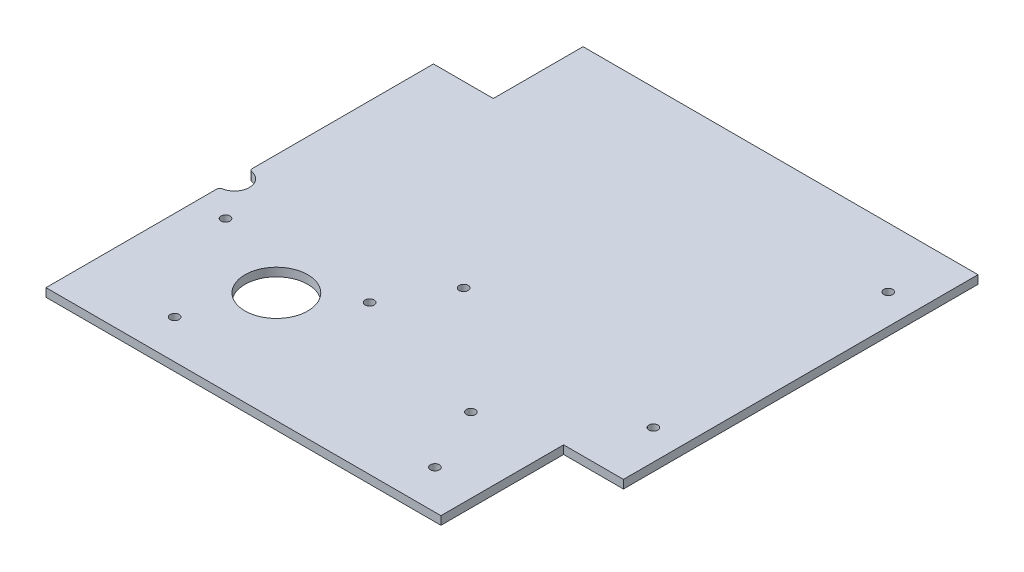
ISO-10303-21;
HEADER;
FILE_DESCRIPTION(('STEP AP214'),'2;1');
FILE_NAME('part.step','',(''),(''),'','','');
FILE_SCHEMA(('AUTOMOTIVE_DESIGN { 1 0 10303 214 1 1 1 1 }'));
ENDSEC;
DATA;
#1=APPLICATION_CONTEXT('core data for automotive mechanical design processes');
#2=APPLICATION_PROTOCOL_DEFINITION('international standard','automotive_design',2000,#1);
#3=PRODUCT_CONTEXT('',#1,'mechanical');
#4=PRODUCT('Part','Part','',(#3));
#5=PRODUCT_RELATED_PRODUCT_CATEGORY('part','',(#4));
#6=PRODUCT_DEFINITION_FORMATION('','',#4);
#7=PRODUCT_DEFINITION_CONTEXT('part definition',#1,'design');
#8=PRODUCT_DEFINITION('design','',#6,#7);
#9=PRODUCT_DEFINITION_SHAPE('','',#8);
#10=(LENGTH_UNIT() NAMED_UNIT(*) SI_UNIT(.MILLI.,.METRE.));
#11=(NAMED_UNIT(*) PLANE_ANGLE_UNIT() SI_UNIT($,.RADIAN.));
#12=(NAMED_UNIT(*) SI_UNIT($,.STERADIAN.) SOLID_ANGLE_UNIT());
#13=UNCERTAINTY_MEASURE_WITH_UNIT(LENGTH_MEASURE(1.E-05),#10,'distance_accuracy_value','');
#14=(GEOMETRIC_REPRESENTATION_CONTEXT(3) GLOBAL_UNCERTAINTY_ASSIGNED_CONTEXT((#13)) GLOBAL_UNIT_ASSIGNED_CONTEXT((#10,
#11,#12)) REPRESENTATION_CONTEXT('',''));
#15=CARTESIAN_POINT('',(0.,0.,0.));
#16=DIRECTION('',(0.,0.,1.));
#17=DIRECTION('',(1.,0.,0.));
#18=AXIS2_PLACEMENT_3D('',#15,#16,#17);
#19=CARTESIAN_POINT('',(-76.,2.8,0.));
#20=DIRECTION('',(-1.,0.,0.));
#21=DIRECTION('',(0.,0.,1.));
#22=AXIS2_PLACEMENT_3D('',#19,#20,#21);
#23=PLANE('',#22);
#24=DIRECTION('',(0.,0.,-1.));
#25=VECTOR('',#24,1.);
#26=CARTESIAN_POINT('',(-76.,2.8,0.));
#27=LINE('',#26,#25);
#28=CARTESIAN_POINT('',(-76.,2.8,79.75));
#29=VERTEX_POINT('',#28);
#30=CARTESIAN_POINT('',(-76.,2.8,22.6660797830996));
#31=VERTEX_POINT('',#30);
#32=EDGE_CURVE('E158',#29,#31,#27,.T.);
#33=ORIENTED_EDGE('',*,*,#32,.T.);
#34=DIRECTION('',(0.,-1.,0.));
#35=VECTOR('',#34,1.);
#36=CARTESIAN_POINT('',(-76.,0.,22.6660797830996));
#37=LINE('',#36,#35);
#38=CARTESIAN_POINT('',(-76.,0.,22.6660797830996));
#39=VERTEX_POINT('',#38);
#40=EDGE_CURVE('E134',#31,#39,#37,.T.);
#41=ORIENTED_EDGE('',*,*,#40,.T.);
#42=DIRECTION('',(0.,0.,-1.));
#43=VECTOR('',#42,1.);
#44=CARTESIAN_POINT('',(-76.,0.,0.));
#45=LINE('',#44,#43);
#46=CARTESIAN_POINT('',(-76.,0.,79.75));
#47=VERTEX_POINT('',#46);
#48=EDGE_CURVE('E194',#47,#39,#45,.T.);
#49=ORIENTED_EDGE('',*,*,#48,.F.);
#50=DIRECTION('',(0.,-1.,0.));
#51=VECTOR('',#50,1.);
#52=CARTESIAN_POINT('',(-76.,2.8,79.75));
#53=LINE('',#52,#51);
#54=EDGE_CURVE('E220',#29,#47,#53,.T.);
#55=ORIENTED_EDGE('',*,*,#54,.F.);
#56=EDGE_LOOP('',(#33,#41,#49,#55));
#57=FACE_BOUND('',#56,.T.);
#58=ADVANCED_FACE('F35',(#57),#23,.T.);
#59=CARTESIAN_POINT('',(0.,2.8,-79.75));
#60=DIRECTION('',(0.,0.,-1.));
#61=DIRECTION('',(-1.,0.,0.));
#62=AXIS2_PLACEMENT_3D('',#59,#60,#61);
#63=PLANE('',#62);
#64=DIRECTION('',(1.,0.,0.));
#65=VECTOR('',#64,1.);
#66=CARTESIAN_POINT('',(0.,0.,-79.75));
#67=LINE('',#66,#65);
#68=CARTESIAN_POINT('',(-56.,0.,-79.75));
#69=VERTEX_POINT('',#68);
#70=CARTESIAN_POINT('',(76.,0.,-79.75));
#71=VERTEX_POINT('',#70);
#72=EDGE_CURVE('E130',#69,#71,#67,.T.);
#73=ORIENTED_EDGE('',*,*,#72,.F.);
#74=DIRECTION('',(0.,-1.,0.));
#75=VECTOR('',#74,1.);
#76=CARTESIAN_POINT('',(-56.,2.8,-79.75));
#77=LINE('',#76,#75);
#78=CARTESIAN_POINT('',(-56.,2.8,-79.75));
#79=VERTEX_POINT('',#78);
#80=EDGE_CURVE('E124',#79,#69,#77,.T.);
#81=ORIENTED_EDGE('',*,*,#80,.F.);
#82=DIRECTION('',(1.,0.,0.));
#83=VECTOR('',#82,1.);
#84=CARTESIAN_POINT('',(0.,2.8,-79.75));
#85=LINE('',#84,#83);
#86=CARTESIAN_POINT('',(76.,2.8,-79.75));
#87=VERTEX_POINT('',#86);
#88=EDGE_CURVE('E128',#79,#87,#85,.T.);
#89=ORIENTED_EDGE('',*,*,#88,.T.);
#90=DIRECTION('',(0.,-1.,0.));
#91=VECTOR('',#90,1.);
#92=CARTESIAN_POINT('',(76.,2.8,-79.75));
#93=LINE('',#92,#91);
#94=EDGE_CURVE('E170',#87,#71,#93,.T.);
#95=ORIENTED_EDGE('',*,*,#94,.T.);
#96=EDGE_LOOP('',(#73,#81,#89,#95));
#97=FACE_BOUND('',#96,.T.);
#98=ADVANCED_FACE('F126',(#97),#63,.T.);
#99=CARTESIAN_POINT('',(-56.,2.8,0.));
#100=DIRECTION('',(1.,0.,0.));
#101=DIRECTION('',(0.,0.,-1.));
#102=AXIS2_PLACEMENT_3D('',#99,#100,#101);
#103=PLANE('',#102);
#104=DIRECTION('',(0.,0.,1.));
#105=VECTOR('',#104,1.);
#106=CARTESIAN_POINT('',(-56.,0.,0.));
#107=LINE('',#106,#105);
#108=CARTESIAN_POINT('',(-56.,0.,-49.75));
#109=VERTEX_POINT('',#108);
#110=EDGE_CURVE('E188',#69,#109,#107,.T.);
#111=ORIENTED_EDGE('',*,*,#110,.T.);
#112=DIRECTION('',(0.,-1.,0.));
#113=VECTOR('',#112,1.);
#114=CARTESIAN_POINT('',(-56.,2.8,-49.75));
#115=LINE('',#114,#113);
#116=CARTESIAN_POINT('',(-56.,2.8,-49.75));
#117=VERTEX_POINT('',#116);
#118=EDGE_CURVE('E135',#117,#109,#115,.T.);
#119=ORIENTED_EDGE('',*,*,#118,.F.);
#120=DIRECTION('',(0.,0.,1.));
#121=VECTOR('',#120,1.);
#122=CARTESIAN_POINT('',(-56.,2.8,0.));
#123=LINE('',#122,#121);
#124=EDGE_CURVE('E138',#79,#117,#123,.T.);
#125=ORIENTED_EDGE('',*,*,#124,.F.);
#126=ORIENTED_EDGE('',*,*,#80,.T.);
#127=EDGE_LOOP('',(#111,#119,#125,#126));
#128=FACE_BOUND('',#127,.T.);
#129=ADVANCED_FACE('F139',(#128),#103,.F.);
#130=CARTESIAN_POINT('',(0.,2.8,-49.75));
#131=DIRECTION('',(0.,0.,-1.));
#132=DIRECTION('',(-1.,0.,0.));
#133=AXIS2_PLACEMENT_3D('',#130,#131,#132);
#134=PLANE('',#133);
#135=DIRECTION('',(1.,0.,0.));
#136=VECTOR('',#135,1.);
#137=CARTESIAN_POINT('',(0.,0.,-49.75));
#138=LINE('',#137,#136);
#139=CARTESIAN_POINT('',(-76.,0.,-49.75));
#140=VERTEX_POINT('',#139);
#141=EDGE_CURVE('E190',#140,#109,#138,.T.);
#142=ORIENTED_EDGE('',*,*,#141,.F.);
#143=DIRECTION('',(0.,-1.,0.));
#144=VECTOR('',#143,1.);
#145=CARTESIAN_POINT('',(-76.,2.8,-49.75));
#146=LINE('',#145,#144);
#147=CARTESIAN_POINT('',(-76.,2.8,-49.75));
#148=VERTEX_POINT('',#147);
#149=EDGE_CURVE('E222',#148,#140,#146,.T.);
#150=ORIENTED_EDGE('',*,*,#149,.F.);
#151=DIRECTION('',(1.,0.,0.));
#152=VECTOR('',#151,1.);
#153=CARTESIAN_POINT('',(0.,2.8,-49.75));
#154=LINE('',#153,#152);
#155=EDGE_CURVE('E142',#148,#117,#154,.T.);
#156=ORIENTED_EDGE('',*,*,#155,.T.);
#157=ORIENTED_EDGE('',*,*,#118,.T.);
#158=EDGE_LOOP('',(#142,#150,#156,#157));
#159=FACE_BOUND('',#158,.T.);
#160=ADVANCED_FACE('F333',(#159),#134,.T.);
#161=CARTESIAN_POINT('',(-76.,0.,10.8339202169004));
#162=VERTEX_POINT('',#161);
#163=EDGE_CURVE('E193',#162,#140,#45,.T.);
#164=ORIENTED_EDGE('',*,*,#163,.F.);
#165=DIRECTION('',(0.,-1.,0.));
#166=VECTOR('',#165,1.);
#167=CARTESIAN_POINT('',(-76.,2.8,10.8339202169004));
#168=LINE('',#167,#166);
#169=CARTESIAN_POINT('',(-76.,2.8,10.8339202169004));
#170=VERTEX_POINT('',#169);
#171=EDGE_CURVE('E11',#162,#170,#168,.F.);
#172=ORIENTED_EDGE('',*,*,#171,.T.);
#173=EDGE_CURVE('E157',#170,#148,#27,.T.);
#174=ORIENTED_EDGE('',*,*,#173,.T.);
#175=ORIENTED_EDGE('',*,*,#149,.T.);
#176=EDGE_LOOP('',(#164,#172,#174,#175));
#177=FACE_BOUND('',#176,.T.);
#178=ADVANCED_FACE('F323',(#177),#23,.T.);
#179=CARTESIAN_POINT('',(0.,2.8,79.75));
#180=DIRECTION('',(0.,0.,-1.));
#181=DIRECTION('',(-1.,0.,0.));
#182=AXIS2_PLACEMENT_3D('',#179,#180,#181);
#183=PLANE('',#182);
#184=DIRECTION('',(1.,0.,0.));
#185=VECTOR('',#184,1.);
#186=CARTESIAN_POINT('',(0.,0.,79.75));
#187=LINE('',#186,#185);
#188=CARTESIAN_POINT('',(56.,0.,79.75));
#189=VERTEX_POINT('',#188);
#190=EDGE_CURVE('E197',#47,#189,#187,.T.);
#191=ORIENTED_EDGE('',*,*,#190,.T.);
#192=DIRECTION('',(0.,-1.,0.));
#193=VECTOR('',#192,1.);
#194=CARTESIAN_POINT('',(56.,2.8,79.75));
#195=LINE('',#194,#193);
#196=CARTESIAN_POINT('',(56.,2.8,79.75));
#197=VERTEX_POINT('',#196);
#198=EDGE_CURVE('E217',#197,#189,#195,.T.);
#199=ORIENTED_EDGE('',*,*,#198,.F.);
#200=DIRECTION('',(1.,0.,0.));
#201=VECTOR('',#200,1.);
#202=CARTESIAN_POINT('',(0.,2.8,79.75));
#203=LINE('',#202,#201);
#204=EDGE_CURVE('E161',#29,#197,#203,.T.);
#205=ORIENTED_EDGE('',*,*,#204,.F.);
#206=ORIENTED_EDGE('',*,*,#54,.T.);
#207=EDGE_LOOP('',(#191,#199,#205,#206));
#208=FACE_BOUND('',#207,.T.);
#209=ADVANCED_FACE('F332',(#208),#183,.F.);
#210=CARTESIAN_POINT('',(56.,2.8,0.));
#211=DIRECTION('',(-1.,0.,0.));
#212=DIRECTION('',(0.,0.,1.));
#213=AXIS2_PLACEMENT_3D('',#210,#211,#212);
#214=PLANE('',#213);
#215=DIRECTION('',(0.,0.,-1.));
#216=VECTOR('',#215,1.);
#217=CARTESIAN_POINT('',(56.,0.,0.));
#218=LINE('',#217,#216);
#219=CARTESIAN_POINT('',(56.,0.,38.75));
#220=VERTEX_POINT('',#219);
#221=EDGE_CURVE('E200',#189,#220,#218,.T.);
#222=ORIENTED_EDGE('',*,*,#221,.T.);
#223=DIRECTION('',(0.,-1.,0.));
#224=VECTOR('',#223,1.);
#225=CARTESIAN_POINT('',(56.,2.8,38.75));
#226=LINE('',#225,#224);
#227=CARTESIAN_POINT('',(56.,2.8,38.75));
#228=VERTEX_POINT('',#227);
#229=EDGE_CURVE('E214',#228,#220,#226,.T.);
#230=ORIENTED_EDGE('',*,*,#229,.F.);
#231=DIRECTION('',(0.,0.,-1.));
#232=VECTOR('',#231,1.);
#233=CARTESIAN_POINT('',(56.,2.8,0.));
#234=LINE('',#233,#232);
#235=EDGE_CURVE('E164',#197,#228,#234,.T.);
#236=ORIENTED_EDGE('',*,*,#235,.F.);
#237=ORIENTED_EDGE('',*,*,#198,.T.);
#238=EDGE_LOOP('',(#222,#230,#236,#237));
#239=FACE_BOUND('',#238,.T.);
#240=ADVANCED_FACE('F338',(#239),#214,.F.);
#241=CARTESIAN_POINT('',(0.,2.8,38.75));
#242=DIRECTION('',(0.,0.,-1.));
#243=DIRECTION('',(-1.,0.,0.));
#244=AXIS2_PLACEMENT_3D('',#241,#242,#243);
#245=PLANE('',#244);
#246=DIRECTION('',(1.,0.,0.));
#247=VECTOR('',#246,1.);
#248=CARTESIAN_POINT('',(0.,0.,38.75));
#249=LINE('',#248,#247);
#250=CARTESIAN_POINT('',(76.,0.,38.75));
#251=VERTEX_POINT('',#250);
#252=EDGE_CURVE('E203',#220,#251,#249,.T.);
#253=ORIENTED_EDGE('',*,*,#252,.T.);
#254=DIRECTION('',(0.,-1.,0.));
#255=VECTOR('',#254,1.);
#256=CARTESIAN_POINT('',(76.,2.8,38.75));
#257=LINE('',#256,#255);
#258=CARTESIAN_POINT('',(76.,2.8,38.75));
#259=VERTEX_POINT('',#258);
#260=EDGE_CURVE('E211',#259,#251,#257,.T.);
#261=ORIENTED_EDGE('',*,*,#260,.F.);
#262=DIRECTION('',(1.,0.,0.));
#263=VECTOR('',#262,1.);
#264=CARTESIAN_POINT('',(0.,2.8,38.75));
#265=LINE('',#264,#263);
#266=EDGE_CURVE('E167',#228,#259,#265,.T.);
#267=ORIENTED_EDGE('',*,*,#266,.F.);
#268=ORIENTED_EDGE('',*,*,#229,.T.);
#269=EDGE_LOOP('',(#253,#261,#267,#268));
#270=FACE_BOUND('',#269,.T.);
#271=ADVANCED_FACE('F303',(#270),#245,.F.);
#272=CARTESIAN_POINT('',(-66.,2.8,29.75));
#273=DIRECTION('',(0.,-1.,0.));
#274=DIRECTION('',(0.,0.,-1.));
#275=AXIS2_PLACEMENT_3D('',#272,#273,#274);
#276=CYLINDRICAL_SURFACE('',#275,1.5);
#277=CARTESIAN_POINT('',(-66.,2.8,29.75));
#278=DIRECTION('',(0.,1.,0.));
#279=DIRECTION('',(0.,0.,1.));
#280=AXIS2_PLACEMENT_3D('',#277,#278,#279);
#281=CIRCLE('',#280,1.5);
#282=CARTESIAN_POINT('',(-66.,2.8,31.25));
#283=VERTEX_POINT('',#282);
#284=EDGE_CURVE('E149',#283,#283,#281,.T.);
#285=ORIENTED_EDGE('',*,*,#284,.T.);
#286=EDGE_LOOP('',(#285));
#287=FACE_BOUND('',#286,.T.);
#288=CARTESIAN_POINT('',(-66.,0.,29.75));
#289=DIRECTION('',(0.,1.,0.));
#290=DIRECTION('',(0.,0.,1.));
#291=AXIS2_PLACEMENT_3D('',#288,#289,#290);
#292=CIRCLE('',#291,1.5);
#293=CARTESIAN_POINT('',(-66.,0.,31.25));
#294=VERTEX_POINT('',#293);
#295=EDGE_CURVE('E184',#294,#294,#292,.T.);
#296=ORIENTED_EDGE('',*,*,#295,.F.);
#297=EDGE_LOOP('',(#296));
#298=FACE_BOUND('',#297,.T.);
#299=ADVANCED_FACE('F300',(#287,#298),#276,.F.);
#300=CARTESIAN_POINT('',(41.,2.8,66.75));
#301=DIRECTION('',(0.,-1.,0.));
#302=DIRECTION('',(0.,0.,-1.));
#303=AXIS2_PLACEMENT_3D('',#300,#301,#302);
#304=CYLINDRICAL_SURFACE('',#303,1.5);
#305=CARTESIAN_POINT('',(41.,2.8,66.75));
#306=DIRECTION('',(0.,1.,0.));
#307=DIRECTION('',(0.,0.,1.));
#308=AXIS2_PLACEMENT_3D('',#305,#306,#307);
#309=CIRCLE('',#308,1.5);
#310=CARTESIAN_POINT('',(41.,2.8,68.25));
#311=VERTEX_POINT('',#310);
#312=EDGE_CURVE('E152',#311,#311,#309,.T.);
#313=ORIENTED_EDGE('',*,*,#312,.T.);
#314=EDGE_LOOP('',(#313));
#315=FACE_BOUND('',#314,.T.);
#316=CARTESIAN_POINT('',(41.,0.,66.75));
#317=DIRECTION('',(0.,1.,0.));
#318=DIRECTION('',(0.,0.,1.));
#319=AXIS2_PLACEMENT_3D('',#316,#317,#318);
#320=CIRCLE('',#319,1.5);
#321=CARTESIAN_POINT('',(41.,0.,68.25));
#322=VERTEX_POINT('',#321);
#323=EDGE_CURVE('E181',#322,#322,#320,.T.);
#324=ORIENTED_EDGE('',*,*,#323,.F.);
#325=EDGE_LOOP('',(#324));
#326=FACE_BOUND('',#325,.T.);
#327=ADVANCED_FACE('F291',(#315,#326),#304,.F.);
#328=CARTESIAN_POINT('',(-46.,2.8,66.75));
#329=DIRECTION('',(0.,-1.,0.));
#330=DIRECTION('',(0.,0.,-1.));
#331=AXIS2_PLACEMENT_3D('',#328,#329,#330);
#332=CYLINDRICAL_SURFACE('',#331,1.5);
#333=CARTESIAN_POINT('',(-46.,2.8,66.75));
#334=DIRECTION('',(0.,1.,0.));
#335=DIRECTION('',(0.,0.,1.));
#336=AXIS2_PLACEMENT_3D('',#333,#334,#335);
#337=CIRCLE('',#336,1.5);
#338=CARTESIAN_POINT('',(-46.,2.8,68.25));
#339=VERTEX_POINT('',#338);
#340=EDGE_CURVE('E286',#339,#339,#337,.T.);
#341=ORIENTED_EDGE('',*,*,#340,.T.);
#342=EDGE_LOOP('',(#341));
#343=FACE_BOUND('',#342,.T.);
#344=CARTESIAN_POINT('',(-46.,0.,66.75));
#345=DIRECTION('',(0.,1.,0.));
#346=DIRECTION('',(0.,0.,1.));
#347=AXIS2_PLACEMENT_3D('',#344,#345,#346);
#348=CIRCLE('',#347,1.5);
#349=CARTESIAN_POINT('',(-46.,0.,68.25));
#350=VERTEX_POINT('',#349);
#351=EDGE_CURVE('E178',#350,#350,#348,.T.);
#352=ORIENTED_EDGE('',*,*,#351,.F.);
#353=EDGE_LOOP('',(#352));
#354=FACE_BOUND('',#353,.T.);
#355=ADVANCED_FACE('F362',(#343,#354),#332,.F.);
#356=CARTESIAN_POINT('',(66.,2.8,-59.75));
#357=DIRECTION('',(0.,-1.,0.));
#358=DIRECTION('',(0.,0.,-1.));
#359=AXIS2_PLACEMENT_3D('',#356,#357,#358);
#360=CYLINDRICAL_SURFACE('',#359,1.5);
#361=CARTESIAN_POINT('',(66.,2.8,-59.75));
#362=DIRECTION('',(0.,1.,0.));
#363=DIRECTION('',(0.,0.,1.));
#364=AXIS2_PLACEMENT_3D('',#361,#362,#363);
#365=CIRCLE('',#364,1.5);
#366=CARTESIAN_POINT('',(66.,2.8,-58.25));
#367=VERTEX_POINT('',#366);
#368=EDGE_CURVE('E283',#367,#367,#365,.T.);
#369=ORIENTED_EDGE('',*,*,#368,.T.);
#370=EDGE_LOOP('',(#369));
#371=FACE_BOUND('',#370,.T.);
#372=CARTESIAN_POINT('',(66.,0.,-59.75));
#373=DIRECTION('',(0.,1.,0.));
#374=DIRECTION('',(0.,0.,1.));
#375=AXIS2_PLACEMENT_3D('',#372,#373,#374);
#376=CIRCLE('',#375,1.5);
#377=CARTESIAN_POINT('',(66.,0.,-58.25));
#378=VERTEX_POINT('',#377);
#379=EDGE_CURVE('E174',#378,#378,#376,.T.);
#380=ORIENTED_EDGE('',*,*,#379,.F.);
#381=EDGE_LOOP('',(#380));
#382=FACE_BOUND('',#381,.T.);
#383=ADVANCED_FACE('F358',(#371,#382),#360,.F.);
#384=CARTESIAN_POINT('',(66.,2.8,18.75));
#385=DIRECTION('',(0.,-1.,0.));
#386=DIRECTION('',(0.,0.,-1.));
#387=AXIS2_PLACEMENT_3D('',#384,#385,#386);
#388=CYLINDRICAL_SURFACE('',#387,1.5);
#389=CARTESIAN_POINT('',(66.,2.8,18.75));
#390=DIRECTION('',(0.,1.,0.));
#391=DIRECTION('',(0.,0.,1.));
#392=AXIS2_PLACEMENT_3D('',#389,#390,#391);
#393=CIRCLE('',#392,1.5);
#394=CARTESIAN_POINT('',(66.,2.8,20.25));
#395=VERTEX_POINT('',#394);
#396=EDGE_CURVE('E209',#395,#395,#393,.T.);
#397=ORIENTED_EDGE('',*,*,#396,.T.);
#398=EDGE_LOOP('',(#397));
#399=FACE_BOUND('',#398,.T.);
#400=CARTESIAN_POINT('',(66.,0.,18.75));
#401=DIRECTION('',(0.,1.,0.));
#402=DIRECTION('',(0.,0.,1.));
#403=AXIS2_PLACEMENT_3D('',#400,#401,#402);
#404=CIRCLE('',#403,1.5);
#405=CARTESIAN_POINT('',(66.,0.,20.25));
#406=VERTEX_POINT('',#405);
#407=EDGE_CURVE('E171',#406,#406,#404,.T.);
#408=ORIENTED_EDGE('',*,*,#407,.F.);
#409=EDGE_LOOP('',(#408));
#410=FACE_BOUND('',#409,.T.);
#411=ADVANCED_FACE('F355',(#399,#410),#388,.F.);
#412=CARTESIAN_POINT('',(76.,2.8,0.));
#413=DIRECTION('',(-1.,0.,0.));
#414=DIRECTION('',(0.,0.,1.));
#415=AXIS2_PLACEMENT_3D('',#412,#413,#414);
#416=PLANE('',#415);
#417=DIRECTION('',(0.,0.,-1.));
#418=VECTOR('',#417,1.);
#419=CARTESIAN_POINT('',(76.,0.,0.));
#420=LINE('',#419,#418);
#421=EDGE_CURVE('E206',#251,#71,#420,.T.);
#422=ORIENTED_EDGE('',*,*,#421,.T.);
#423=ORIENTED_EDGE('',*,*,#94,.F.);
#424=DIRECTION('',(0.,0.,-1.));
#425=VECTOR('',#424,1.);
#426=CARTESIAN_POINT('',(76.,2.8,0.));
#427=LINE('',#426,#425);
#428=EDGE_CURVE('E147',#259,#87,#427,.T.);
#429=ORIENTED_EDGE('',*,*,#428,.F.);
#430=ORIENTED_EDGE('',*,*,#260,.T.);
#431=EDGE_LOOP('',(#422,#423,#429,#430));
#432=FACE_BOUND('',#431,.T.);
#433=ADVANCED_FACE('F296',(#432),#416,.F.);
#434=CARTESIAN_POINT('',(0.,2.8,0.));
#435=DIRECTION('',(0.,1.,0.));
#436=DIRECTION('',(0.,0.,1.));
#437=AXIS2_PLACEMENT_3D('',#434,#435,#436);
#438=PLANE('',#437);
#439=CARTESIAN_POINT('',(-76.,2.8,16.75));
#440=DIRECTION('',(0.,1.,0.));
#441=DIRECTION('',(0.,0.,1.));
#442=AXIS2_PLACEMENT_3D('',#439,#440,#441);
#443=CIRCLE('',#442,5.);
#444=CARTESIAN_POINT('',(-75.1666666666667,2.8,21.6800664859163));
#445=VERTEX_POINT('',#444);
#446=CARTESIAN_POINT('',(-75.1666666666667,2.8,11.8199335140837));
#447=VERTEX_POINT('',#446);
#448=EDGE_CURVE('E238',#445,#447,#443,.T.);
#449=ORIENTED_EDGE('',*,*,#448,.F.);
#450=CARTESIAN_POINT('',(-75.,2.8,22.6660797830996));
#451=DIRECTION('',(0.,1.,0.));
#452=DIRECTION('',(0.,0.,1.));
#453=AXIS2_PLACEMENT_3D('',#450,#451,#452);
#454=CIRCLE('',#453,1.);
#455=EDGE_CURVE('E43',#445,#31,#454,.T.);
#456=ORIENTED_EDGE('',*,*,#455,.T.);
#457=ORIENTED_EDGE('',*,*,#32,.F.);
#458=ORIENTED_EDGE('',*,*,#204,.T.);
#459=ORIENTED_EDGE('',*,*,#235,.T.);
#460=ORIENTED_EDGE('',*,*,#266,.T.);
#461=ORIENTED_EDGE('',*,*,#428,.T.);
#462=ORIENTED_EDGE('',*,*,#88,.F.);
#463=ORIENTED_EDGE('',*,*,#124,.T.);
#464=ORIENTED_EDGE('',*,*,#155,.F.);
#465=ORIENTED_EDGE('',*,*,#173,.F.);
#466=CARTESIAN_POINT('',(-75.,2.8,10.8339202169004));
#467=DIRECTION('',(0.,1.,0.));
#468=DIRECTION('',(0.,0.,1.));
#469=AXIS2_PLACEMENT_3D('',#466,#467,#468);
#470=CIRCLE('',#469,1.);
#471=EDGE_CURVE('E50',#170,#447,#470,.T.);
#472=ORIENTED_EDGE('',*,*,#471,.T.);
#473=EDGE_LOOP('',(#449,#456,#457,#458,#459,#460,#461,#462,#463,#464,#465,#472));
#474=FACE_BOUND('',#473,.T.);
#475=CARTESIAN_POINT('',(-36.,2.8,42.75));
#476=DIRECTION('',(0.,1.,0.));
#477=DIRECTION('',(0.,0.,1.));
#478=AXIS2_PLACEMENT_3D('',#475,#476,#477);
#479=CIRCLE('',#478,10.5);
#480=CARTESIAN_POINT('',(-36.,2.8,53.25));
#481=VERTEX_POINT('',#480);
#482=EDGE_CURVE('E255',#481,#481,#479,.T.);
#483=ORIENTED_EDGE('',*,*,#482,.F.);
#484=EDGE_LOOP('',(#483));
#485=FACE_BOUND('',#484,.T.);
#486=CARTESIAN_POINT('',(31.,2.8,44.75));
#487=DIRECTION('',(0.,1.,0.));
#488=DIRECTION('',(0.,0.,1.));
#489=AXIS2_PLACEMENT_3D('',#486,#487,#488);
#490=CIRCLE('',#489,1.5);
#491=CARTESIAN_POINT('',(31.,2.8,46.25));
#492=VERTEX_POINT('',#491);
#493=EDGE_CURVE('E265',#492,#492,#490,.T.);
#494=ORIENTED_EDGE('',*,*,#493,.F.);
#495=EDGE_LOOP('',(#494));
#496=FACE_BOUND('',#495,.T.);
#497=CARTESIAN_POINT('',(-17.6182574873298,2.8,29.9592921435213));
#498=DIRECTION('',(0.,1.,0.));
#499=DIRECTION('',(0.,0.,1.));
#500=AXIS2_PLACEMENT_3D('',#497,#498,#499);
#501=CIRCLE('',#500,1.5);
#502=CARTESIAN_POINT('',(-17.6182574873298,2.8,31.4592921435213));
#503=VERTEX_POINT('',#502);
#504=EDGE_CURVE('E271',#503,#503,#501,.T.);
#505=ORIENTED_EDGE('',*,*,#504,.F.);
#506=EDGE_LOOP('',(#505));
#507=FACE_BOUND('',#506,.T.);
#508=CARTESIAN_POINT('',(-6.11825748732994,2.8,10.0407078564792));
#509=DIRECTION('',(0.,1.,0.));
#510=DIRECTION('',(0.,0.,1.));
#511=AXIS2_PLACEMENT_3D('',#508,#509,#510);
#512=CIRCLE('',#511,1.5);
#513=CARTESIAN_POINT('',(-6.11825748732994,2.8,11.5407078564792));
#514=VERTEX_POINT('',#513);
#515=EDGE_CURVE('E264',#514,#514,#512,.T.);
#516=ORIENTED_EDGE('',*,*,#515,.F.);
#517=EDGE_LOOP('',(#516));
#518=FACE_BOUND('',#517,.T.);
#519=ORIENTED_EDGE('',*,*,#396,.F.);
#520=EDGE_LOOP('',(#519));
#521=FACE_BOUND('',#520,.T.);
#522=ORIENTED_EDGE('',*,*,#368,.F.);
#523=EDGE_LOOP('',(#522));
#524=FACE_BOUND('',#523,.T.);
#525=ORIENTED_EDGE('',*,*,#340,.F.);
#526=EDGE_LOOP('',(#525));
#527=FACE_BOUND('',#526,.T.);
#528=ORIENTED_EDGE('',*,*,#312,.F.);
#529=EDGE_LOOP('',(#528));
#530=FACE_BOUND('',#529,.T.);
#531=ORIENTED_EDGE('',*,*,#284,.F.);
#532=EDGE_LOOP('',(#531));
#533=FACE_BOUND('',#532,.T.);
#534=ADVANCED_FACE('F144',(#474,#485,#496,#507,#518,#521,#524,#527,#530,#533),#438,.T.);
#535=CARTESIAN_POINT('',(0.,0.,0.));
#536=DIRECTION('',(0.,1.,0.));
#537=DIRECTION('',(0.,0.,1.));
#538=AXIS2_PLACEMENT_3D('',#535,#536,#537);
#539=PLANE('',#538);
#540=CARTESIAN_POINT('',(-36.,0.,42.75));
#541=DIRECTION('',(0.,1.,0.));
#542=DIRECTION('',(0.,0.,1.));
#543=AXIS2_PLACEMENT_3D('',#540,#541,#542);
#544=CIRCLE('',#543,10.5);
#545=CARTESIAN_POINT('',(-36.,0.,53.25));
#546=VERTEX_POINT('',#545);
#547=EDGE_CURVE('E258',#546,#546,#544,.F.);
#548=ORIENTED_EDGE('',*,*,#547,.F.);
#549=EDGE_LOOP('',(#548));
#550=FACE_BOUND('',#549,.T.);
#551=CARTESIAN_POINT('',(31.,0.,44.75));
#552=DIRECTION('',(0.,1.,0.));
#553=DIRECTION('',(0.,0.,1.));
#554=AXIS2_PLACEMENT_3D('',#551,#552,#553);
#555=CIRCLE('',#554,1.5);
#556=CARTESIAN_POINT('',(31.,0.,46.25));
#557=VERTEX_POINT('',#556);
#558=EDGE_CURVE('E175',#557,#557,#555,.F.);
#559=ORIENTED_EDGE('',*,*,#558,.F.);
#560=EDGE_LOOP('',(#559));
#561=FACE_BOUND('',#560,.T.);
#562=CARTESIAN_POINT('',(-17.6182574873298,0.,29.9592921435213));
#563=DIRECTION('',(0.,1.,0.));
#564=DIRECTION('',(0.,0.,1.));
#565=AXIS2_PLACEMENT_3D('',#562,#563,#564);
#566=CIRCLE('',#565,1.5);
#567=CARTESIAN_POINT('',(-17.6182574873298,0.,31.4592921435213));
#568=VERTEX_POINT('',#567);
#569=EDGE_CURVE('E268',#568,#568,#566,.F.);
#570=ORIENTED_EDGE('',*,*,#569,.F.);
#571=EDGE_LOOP('',(#570));
#572=FACE_BOUND('',#571,.T.);
#573=CARTESIAN_POINT('',(-6.11825748732994,0.,10.0407078564792));
#574=DIRECTION('',(0.,1.,0.));
#575=DIRECTION('',(0.,0.,1.));
#576=AXIS2_PLACEMENT_3D('',#573,#574,#575);
#577=CIRCLE('',#576,1.5);
#578=CARTESIAN_POINT('',(-6.11825748732994,0.,11.5407078564792));
#579=VERTEX_POINT('',#578);
#580=EDGE_CURVE('E274',#579,#579,#577,.F.);
#581=ORIENTED_EDGE('',*,*,#580,.F.);
#582=EDGE_LOOP('',(#581));
#583=FACE_BOUND('',#582,.T.);
#584=ORIENTED_EDGE('',*,*,#407,.T.);
#585=EDGE_LOOP('',(#584));
#586=FACE_BOUND('',#585,.T.);
#587=ORIENTED_EDGE('',*,*,#379,.T.);
#588=EDGE_LOOP('',(#587));
#589=FACE_BOUND('',#588,.T.);
#590=ORIENTED_EDGE('',*,*,#351,.T.);
#591=EDGE_LOOP('',(#590));
#592=FACE_BOUND('',#591,.T.);
#593=ORIENTED_EDGE('',*,*,#323,.T.);
#594=EDGE_LOOP('',(#593));
#595=FACE_BOUND('',#594,.T.);
#596=ORIENTED_EDGE('',*,*,#295,.T.);
#597=EDGE_LOOP('',(#596));
#598=FACE_BOUND('',#597,.T.);
#599=ORIENTED_EDGE('',*,*,#48,.T.);
#600=CARTESIAN_POINT('',(-75.,0.,22.6660797830996));
#601=DIRECTION('',(0.,1.,0.));
#602=DIRECTION('',(0.,0.,1.));
#603=AXIS2_PLACEMENT_3D('',#600,#601,#602);
#604=CIRCLE('',#603,1.);
#605=CARTESIAN_POINT('',(-75.1666666666667,0.,21.6800664859163));
#606=VERTEX_POINT('',#605);
#607=EDGE_CURVE('E230',#39,#606,#604,.F.);
#608=ORIENTED_EDGE('',*,*,#607,.T.);
#609=CARTESIAN_POINT('',(-76.,0.,16.75));
#610=DIRECTION('',(0.,1.,0.));
#611=DIRECTION('',(0.,0.,1.));
#612=AXIS2_PLACEMENT_3D('',#609,#610,#611);
#613=CIRCLE('',#612,5.);
#614=CARTESIAN_POINT('',(-75.1666666666667,0.,11.8199335140837));
#615=VERTEX_POINT('',#614);
#616=EDGE_CURVE('E250',#615,#606,#613,.F.);
#617=ORIENTED_EDGE('',*,*,#616,.F.);
#618=CARTESIAN_POINT('',(-75.,0.,10.8339202169004));
#619=DIRECTION('',(0.,1.,0.));
#620=DIRECTION('',(0.,0.,1.));
#621=AXIS2_PLACEMENT_3D('',#618,#619,#620);
#622=CIRCLE('',#621,1.);
#623=EDGE_CURVE('E228',#615,#162,#622,.F.);
#624=ORIENTED_EDGE('',*,*,#623,.T.);
#625=ORIENTED_EDGE('',*,*,#163,.T.);
#626=ORIENTED_EDGE('',*,*,#141,.T.);
#627=ORIENTED_EDGE('',*,*,#110,.F.);
#628=ORIENTED_EDGE('',*,*,#72,.T.);
#629=ORIENTED_EDGE('',*,*,#421,.F.);
#630=ORIENTED_EDGE('',*,*,#252,.F.);
#631=ORIENTED_EDGE('',*,*,#221,.F.);
#632=ORIENTED_EDGE('',*,*,#190,.F.);
#633=EDGE_LOOP('',(#599,#608,#617,#624,#625,#626,#627,#628,#629,#630,#631,#632));
#634=FACE_BOUND('',#633,.T.);
#635=ADVANCED_FACE('F249',(#550,#561,#572,#583,#586,#589,#592,#595,#598,#634),#539,.F.);
#636=CARTESIAN_POINT('',(-6.11825748732994,-0.00100000000000013,10.0407078564792));
#637=DIRECTION('',(0.,1.,0.));
#638=DIRECTION('',(0.,0.,1.));
#639=AXIS2_PLACEMENT_3D('',#636,#637,#638);
#640=CYLINDRICAL_SURFACE('',#639,1.5);
#641=ORIENTED_EDGE('',*,*,#515,.T.);
#642=EDGE_LOOP('',(#641));
#643=FACE_BOUND('',#642,.T.);
#644=ORIENTED_EDGE('',*,*,#580,.T.);
#645=EDGE_LOOP('',(#644));
#646=FACE_BOUND('',#645,.T.);
#647=ADVANCED_FACE('F308',(#643,#646),#640,.F.);
#648=CARTESIAN_POINT('',(-17.6182574873298,-0.00100000000000013,29.9592921435213));
#649=DIRECTION('',(0.,1.,0.));
#650=DIRECTION('',(0.,0.,1.));
#651=AXIS2_PLACEMENT_3D('',#648,#649,#650);
#652=CYLINDRICAL_SURFACE('',#651,1.5);
#653=ORIENTED_EDGE('',*,*,#504,.T.);
#654=EDGE_LOOP('',(#653));
#655=FACE_BOUND('',#654,.T.);
#656=ORIENTED_EDGE('',*,*,#569,.T.);
#657=EDGE_LOOP('',(#656));
#658=FACE_BOUND('',#657,.T.);
#659=ADVANCED_FACE('F315',(#655,#658),#652,.F.);
#660=CARTESIAN_POINT('',(31.,-0.00100000000000013,44.75));
#661=DIRECTION('',(0.,1.,0.));
#662=DIRECTION('',(0.,0.,1.));
#663=AXIS2_PLACEMENT_3D('',#660,#661,#662);
#664=CYLINDRICAL_SURFACE('',#663,1.5);
#665=ORIENTED_EDGE('',*,*,#493,.T.);
#666=EDGE_LOOP('',(#665));
#667=FACE_BOUND('',#666,.T.);
#668=ORIENTED_EDGE('',*,*,#558,.T.);
#669=EDGE_LOOP('',(#668));
#670=FACE_BOUND('',#669,.T.);
#671=ADVANCED_FACE('F446',(#667,#670),#664,.F.);
#672=CARTESIAN_POINT('',(-36.,-0.00100000000000013,42.75));
#673=DIRECTION('',(0.,1.,0.));
#674=DIRECTION('',(0.,0.,1.));
#675=AXIS2_PLACEMENT_3D('',#672,#673,#674);
#676=CYLINDRICAL_SURFACE('',#675,10.5);
#677=ORIENTED_EDGE('',*,*,#482,.T.);
#678=EDGE_LOOP('',(#677));
#679=FACE_BOUND('',#678,.T.);
#680=ORIENTED_EDGE('',*,*,#547,.T.);
#681=EDGE_LOOP('',(#680));
#682=FACE_BOUND('',#681,.T.);
#683=ADVANCED_FACE('F352',(#679,#682),#676,.F.);
#684=CARTESIAN_POINT('',(-76.,-0.00100000000000013,16.75));
#685=DIRECTION('',(0.,1.,0.));
#686=DIRECTION('',(0.,0.,1.));
#687=AXIS2_PLACEMENT_3D('',#684,#685,#686);
#688=CYLINDRICAL_SURFACE('',#687,5.);
#689=ORIENTED_EDGE('',*,*,#616,.T.);
#690=DIRECTION('',(0.,1.,0.));
#691=VECTOR('',#690,1.);
#692=CARTESIAN_POINT('',(-75.1666666666667,-0.00100000000000013,21.6800664859164));
#693=LINE('',#692,#691);
#694=EDGE_CURVE('E234',#606,#445,#693,.T.);
#695=ORIENTED_EDGE('',*,*,#694,.T.);
#696=ORIENTED_EDGE('',*,*,#448,.T.);
#697=DIRECTION('',(0.,1.,0.));
#698=VECTOR('',#697,1.);
#699=CARTESIAN_POINT('',(-75.1666666666667,-0.00100000000000013,11.8199335140837));
#700=LINE('',#699,#698);
#701=EDGE_CURVE('E232',#447,#615,#700,.F.);
#702=ORIENTED_EDGE('',*,*,#701,.T.);
#703=EDGE_LOOP('',(#689,#695,#696,#702));
#704=FACE_BOUND('',#703,.T.);
#705=ADVANCED_FACE('F254',(#704),#688,.F.);
#706=CARTESIAN_POINT('',(-75.,-0.00100000000000013,22.6660797830996));
#707=DIRECTION('',(0.,1.,0.));
#708=DIRECTION('',(0.,0.,1.));
#709=AXIS2_PLACEMENT_3D('',#706,#707,#708);
#710=CYLINDRICAL_SURFACE('',#709,1.);
#711=ORIENTED_EDGE('',*,*,#455,.F.);
#712=ORIENTED_EDGE('',*,*,#694,.F.);
#713=ORIENTED_EDGE('',*,*,#607,.F.);
#714=ORIENTED_EDGE('',*,*,#40,.F.);
#715=EDGE_LOOP('',(#711,#712,#713,#714));
#716=FACE_BOUND('',#715,.T.);
#717=ADVANCED_FACE('F245',(#716),#710,.T.);
#718=CARTESIAN_POINT('',(-75.,-0.00100000000000013,10.8339202169004));
#719=DIRECTION('',(0.,1.,0.));
#720=DIRECTION('',(0.,0.,1.));
#721=AXIS2_PLACEMENT_3D('',#718,#719,#720);
#722=CYLINDRICAL_SURFACE('',#721,1.);
#723=ORIENTED_EDGE('',*,*,#623,.F.);
#724=ORIENTED_EDGE('',*,*,#701,.F.);
#725=ORIENTED_EDGE('',*,*,#471,.F.);
#726=ORIENTED_EDGE('',*,*,#171,.F.);
#727=EDGE_LOOP('',(#723,#724,#725,#726));
#728=FACE_BOUND('',#727,.T.);
#729=ADVANCED_FACE('F37',(#728),#722,.T.);
#730=CLOSED_SHELL('',(#58,#98,#129,#160,#178,#209,#240,#271,#299,#327,#355,#383,#411,#433,#534,
#635,#647,#659,#671,#683,#705,#717,#729));
#731=MANIFOLD_SOLID_BREP('B2',#730);
#732=ADVANCED_BREP_SHAPE_REPRESENTATION('',(#18,#731),#14);
#733=SHAPE_DEFINITION_REPRESENTATION(#9,#732);
ENDSEC;
END-ISO-10303-21;
